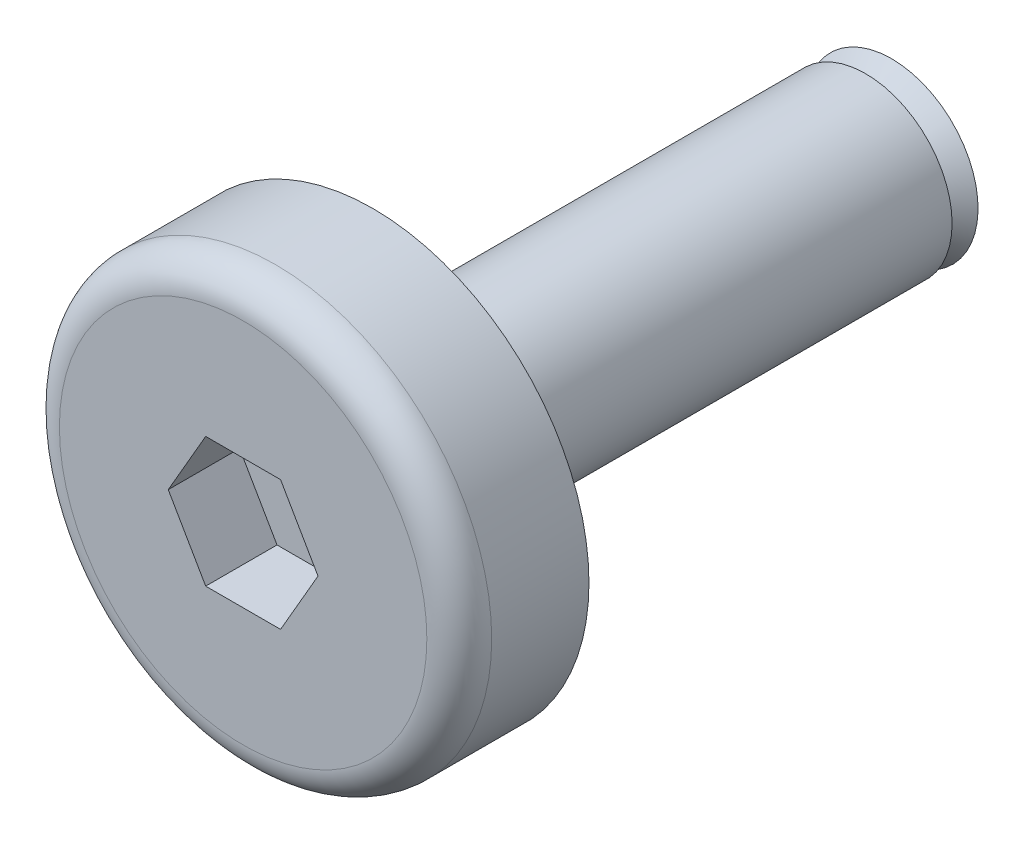
ISO-10303-21;
HEADER;
FILE_DESCRIPTION(('STEP AP214'),'2;1');
FILE_NAME('part.step','',(''),(''),'','','');
FILE_SCHEMA(('AUTOMOTIVE_DESIGN { 1 0 10303 214 1 1 1 1 }'));
ENDSEC;
DATA;
#1=APPLICATION_CONTEXT('core data for automotive mechanical design processes');
#2=APPLICATION_PROTOCOL_DEFINITION('international standard','automotive_design',2000,#1);
#3=PRODUCT_CONTEXT('',#1,'mechanical');
#4=PRODUCT('Part','Part','',(#3));
#5=PRODUCT_RELATED_PRODUCT_CATEGORY('part','',(#4));
#6=PRODUCT_DEFINITION_FORMATION('','',#4);
#7=PRODUCT_DEFINITION_CONTEXT('part definition',#1,'design');
#8=PRODUCT_DEFINITION('design','',#6,#7);
#9=PRODUCT_DEFINITION_SHAPE('','',#8);
#10=(LENGTH_UNIT() NAMED_UNIT(*) SI_UNIT(.MILLI.,.METRE.));
#11=(NAMED_UNIT(*) PLANE_ANGLE_UNIT() SI_UNIT($,.RADIAN.));
#12=(NAMED_UNIT(*) SI_UNIT($,.STERADIAN.) SOLID_ANGLE_UNIT());
#13=UNCERTAINTY_MEASURE_WITH_UNIT(LENGTH_MEASURE(1.E-05),#10,'distance_accuracy_value','');
#14=(GEOMETRIC_REPRESENTATION_CONTEXT(3) GLOBAL_UNCERTAINTY_ASSIGNED_CONTEXT((#13)) GLOBAL_UNIT_ASSIGNED_CONTEXT((#10,
#11,#12)) REPRESENTATION_CONTEXT('',''));
#15=CARTESIAN_POINT('',(0.,0.,0.));
#16=DIRECTION('',(0.,0.,1.));
#17=DIRECTION('',(1.,0.,0.));
#18=AXIS2_PLACEMENT_3D('',#15,#16,#17);
#19=CARTESIAN_POINT('',(0.,0.,1.5));
#20=DIRECTION('',(0.,0.,1.));
#21=DIRECTION('',(1.,0.,0.));
#22=AXIS2_PLACEMENT_3D('',#19,#20,#21);
#23=PLANE('',#22);
#24=CARTESIAN_POINT('',(0.,0.,1.5));
#25=DIRECTION('',(0.,0.,1.));
#26=DIRECTION('',(1.,0.,0.));
#27=AXIS2_PLACEMENT_3D('',#24,#25,#26);
#28=CIRCLE('',#27,2.125);
#29=CARTESIAN_POINT('',(2.125,0.,1.5));
#30=VERTEX_POINT('',#29);
#31=EDGE_CURVE('E142',#30,#30,#28,.T.);
#32=ORIENTED_EDGE('',*,*,#31,.T.);
#33=EDGE_LOOP('',(#32));
#34=FACE_BOUND('',#33,.T.);
#35=DIRECTION('',(0.5,-0.866025403784439,0.));
#36=VECTOR('',#35,1.);
#37=CARTESIAN_POINT('',(0.649519052838329,0.375,1.5));
#38=LINE('',#37,#36);
#39=CARTESIAN_POINT('',(0.433012701892219,0.75,1.5));
#40=VERTEX_POINT('',#39);
#41=CARTESIAN_POINT('',(0.866025403784439,0.,1.5));
#42=VERTEX_POINT('',#41);
#43=EDGE_CURVE('E51',#40,#42,#38,.T.);
#44=ORIENTED_EDGE('',*,*,#43,.T.);
#45=DIRECTION('',(-0.5,-0.866025403784439,0.));
#46=VECTOR('',#45,1.);
#47=CARTESIAN_POINT('',(0.649519052838329,-0.375,1.5));
#48=LINE('',#47,#46);
#49=CARTESIAN_POINT('',(0.433012701892219,-0.75,1.5));
#50=VERTEX_POINT('',#49);
#51=EDGE_CURVE('E11',#42,#50,#48,.T.);
#52=ORIENTED_EDGE('',*,*,#51,.T.);
#53=DIRECTION('',(-1.,0.,0.));
#54=VECTOR('',#53,1.);
#55=CARTESIAN_POINT('',(0.,-0.75,1.5));
#56=LINE('',#55,#54);
#57=CARTESIAN_POINT('',(-0.43301270189222,-0.75,1.5));
#58=VERTEX_POINT('',#57);
#59=EDGE_CURVE('E148',#50,#58,#56,.T.);
#60=ORIENTED_EDGE('',*,*,#59,.T.);
#61=DIRECTION('',(-0.5,0.866025403784439,0.));
#62=VECTOR('',#61,1.);
#63=CARTESIAN_POINT('',(-0.649519052838329,-0.375,1.5));
#64=LINE('',#63,#62);
#65=CARTESIAN_POINT('',(-0.866025403784439,0.,1.5));
#66=VERTEX_POINT('',#65);
#67=EDGE_CURVE('E151',#58,#66,#64,.T.);
#68=ORIENTED_EDGE('',*,*,#67,.T.);
#69=DIRECTION('',(0.5,0.866025403784438,0.));
#70=VECTOR('',#69,1.);
#71=CARTESIAN_POINT('',(-0.649519052838329,0.375,1.5));
#72=LINE('',#71,#70);
#73=CARTESIAN_POINT('',(-0.433012701892219,0.75,1.5));
#74=VERTEX_POINT('',#73);
#75=EDGE_CURVE('E154',#66,#74,#72,.T.);
#76=ORIENTED_EDGE('',*,*,#75,.T.);
#77=DIRECTION('',(1.,0.,0.));
#78=VECTOR('',#77,1.);
#79=CARTESIAN_POINT('',(0.,0.75,1.5));
#80=LINE('',#79,#78);
#81=EDGE_CURVE('E157',#74,#40,#80,.T.);
#82=ORIENTED_EDGE('',*,*,#81,.T.);
#83=EDGE_LOOP('',(#44,#52,#60,#68,#76,#82));
#84=FACE_BOUND('',#83,.T.);
#85=ADVANCED_FACE('F43',(#34,#84),#23,.T.);
#86=CARTESIAN_POINT('',(0.,0.,1.5));
#87=DIRECTION('',(0.,0.,-1.));
#88=DIRECTION('',(-1.,0.,0.));
#89=AXIS2_PLACEMENT_3D('',#86,#87,#88);
#90=CYLINDRICAL_SURFACE('',#89,2.5);
#91=CARTESIAN_POINT('',(0.,0.,1.125));
#92=DIRECTION('',(0.,0.,1.));
#93=DIRECTION('',(1.,0.,0.));
#94=AXIS2_PLACEMENT_3D('',#91,#92,#93);
#95=CIRCLE('',#94,2.5);
#96=CARTESIAN_POINT('',(2.5,0.,1.125));
#97=VERTEX_POINT('',#96);
#98=EDGE_CURVE('E145',#97,#97,#95,.F.);
#99=ORIENTED_EDGE('',*,*,#98,.T.);
#100=EDGE_LOOP('',(#99));
#101=FACE_BOUND('',#100,.T.);
#102=CARTESIAN_POINT('',(0.,0.,0.));
#103=DIRECTION('',(0.,0.,1.));
#104=DIRECTION('',(1.,0.,0.));
#105=AXIS2_PLACEMENT_3D('',#102,#103,#104);
#106=CIRCLE('',#105,2.5);
#107=CARTESIAN_POINT('',(2.5,0.,0.));
#108=VERTEX_POINT('',#107);
#109=EDGE_CURVE('E100',#108,#108,#106,.T.);
#110=ORIENTED_EDGE('',*,*,#109,.T.);
#111=EDGE_LOOP('',(#110));
#112=FACE_BOUND('',#111,.T.);
#113=ADVANCED_FACE('F181',(#101,#112),#90,.T.);
#114=CARTESIAN_POINT('',(0.,0.,0.));
#115=DIRECTION('',(0.,0.,1.));
#116=DIRECTION('',(1.,0.,0.));
#117=AXIS2_PLACEMENT_3D('',#114,#115,#116);
#118=PLANE('',#117);
#119=CARTESIAN_POINT('',(0.,0.,0.));
#120=DIRECTION('',(0.,0.,1.));
#121=DIRECTION('',(1.,0.,0.));
#122=AXIS2_PLACEMENT_3D('',#119,#120,#121);
#123=CIRCLE('',#122,1.);
#124=CARTESIAN_POINT('',(1.,0.,0.));
#125=VERTEX_POINT('',#124);
#126=EDGE_CURVE('E119',#125,#125,#123,.T.);
#127=ORIENTED_EDGE('',*,*,#126,.T.);
#128=EDGE_LOOP('',(#127));
#129=FACE_BOUND('',#128,.T.);
#130=ORIENTED_EDGE('',*,*,#109,.F.);
#131=EDGE_LOOP('',(#130));
#132=FACE_BOUND('',#131,.T.);
#133=ADVANCED_FACE('F187',(#129,#132),#118,.F.);
#134=CARTESIAN_POINT('',(0.,0.,1.125));
#135=DIRECTION('',(0.,0.,1.));
#136=DIRECTION('',(1.,0.,0.));
#137=AXIS2_PLACEMENT_3D('',#134,#135,#136);
#138=TOROIDAL_SURFACE('',#137,2.125,0.375);
#139=ORIENTED_EDGE('',*,*,#98,.F.);
#140=EDGE_LOOP('',(#139));
#141=FACE_BOUND('',#140,.T.);
#142=ORIENTED_EDGE('',*,*,#31,.F.);
#143=EDGE_LOOP('',(#142));
#144=FACE_BOUND('',#143,.T.);
#145=ADVANCED_FACE('F45',(#141,#144),#138,.T.);
#146=CARTESIAN_POINT('',(0.433012701892219,-0.75,1.51));
#147=DIRECTION('',(-0.866025403784439,0.5,0.));
#148=DIRECTION('',(-0.5,-0.866025403784439,0.));
#149=AXIS2_PLACEMENT_3D('',#146,#147,#148);
#150=PLANE('',#149);
#151=DIRECTION('',(0.,0.,-1.));
#152=VECTOR('',#151,1.);
#153=CARTESIAN_POINT('',(0.866025403784439,0.,1.51));
#154=LINE('',#153,#152);
#155=CARTESIAN_POINT('',(0.866025403784439,0.,0.675));
#156=VERTEX_POINT('',#155);
#157=EDGE_CURVE('E93',#42,#156,#154,.T.);
#158=ORIENTED_EDGE('',*,*,#157,.T.);
#159=DIRECTION('',(0.5,0.866025403784439,0.));
#160=VECTOR('',#159,1.);
#161=CARTESIAN_POINT('',(0.433012701892219,-0.75,0.675));
#162=LINE('',#161,#160);
#163=CARTESIAN_POINT('',(0.433012701892219,-0.75,0.675));
#164=VERTEX_POINT('',#163);
#165=EDGE_CURVE('E97',#164,#156,#162,.T.);
#166=ORIENTED_EDGE('',*,*,#165,.F.);
#167=DIRECTION('',(0.,0.,-1.));
#168=VECTOR('',#167,1.);
#169=CARTESIAN_POINT('',(0.433012701892219,-0.75,1.51));
#170=LINE('',#169,#168);
#171=EDGE_CURVE('E132',#50,#164,#170,.T.);
#172=ORIENTED_EDGE('',*,*,#171,.F.);
#173=ORIENTED_EDGE('',*,*,#51,.F.);
#174=EDGE_LOOP('',(#158,#166,#172,#173));
#175=FACE_BOUND('',#174,.T.);
#176=ADVANCED_FACE('F95',(#175),#150,.T.);
#177=CARTESIAN_POINT('',(0.866025403784439,0.,1.51));
#178=DIRECTION('',(-0.866025403784439,-0.5,0.));
#179=DIRECTION('',(0.,0.,1.));
#180=AXIS2_PLACEMENT_3D('',#177,#178,#179);
#181=PLANE('',#180);
#182=DIRECTION('',(0.,0.,-1.));
#183=VECTOR('',#182,1.);
#184=CARTESIAN_POINT('',(0.433012701892219,0.75,1.51));
#185=LINE('',#184,#183);
#186=CARTESIAN_POINT('',(0.433012701892219,0.75,0.675));
#187=VERTEX_POINT('',#186);
#188=EDGE_CURVE('E101',#40,#187,#185,.T.);
#189=ORIENTED_EDGE('',*,*,#188,.T.);
#190=DIRECTION('',(-0.5,0.866025403784439,0.));
#191=VECTOR('',#190,1.);
#192=CARTESIAN_POINT('',(0.866025403784439,0.,0.675));
#193=LINE('',#192,#191);
#194=EDGE_CURVE('E104',#156,#187,#193,.T.);
#195=ORIENTED_EDGE('',*,*,#194,.F.);
#196=ORIENTED_EDGE('',*,*,#157,.F.);
#197=ORIENTED_EDGE('',*,*,#43,.F.);
#198=EDGE_LOOP('',(#189,#195,#196,#197));
#199=FACE_BOUND('',#198,.T.);
#200=ADVANCED_FACE('F105',(#199),#181,.T.);
#201=CARTESIAN_POINT('',(0.433012701892219,0.75,1.51));
#202=DIRECTION('',(0.,-1.,0.));
#203=DIRECTION('',(1.,0.,0.));
#204=AXIS2_PLACEMENT_3D('',#201,#202,#203);
#205=PLANE('',#204);
#206=DIRECTION('',(0.,0.,-1.));
#207=VECTOR('',#206,1.);
#208=CARTESIAN_POINT('',(-0.433012701892219,0.75,1.51));
#209=LINE('',#208,#207);
#210=CARTESIAN_POINT('',(-0.433012701892219,0.75,0.675));
#211=VERTEX_POINT('',#210);
#212=EDGE_CURVE('E137',#74,#211,#209,.T.);
#213=ORIENTED_EDGE('',*,*,#212,.T.);
#214=DIRECTION('',(-1.,0.,0.));
#215=VECTOR('',#214,1.);
#216=CARTESIAN_POINT('',(0.433012701892219,0.75,0.675));
#217=LINE('',#216,#215);
#218=EDGE_CURVE('E110',#187,#211,#217,.T.);
#219=ORIENTED_EDGE('',*,*,#218,.F.);
#220=ORIENTED_EDGE('',*,*,#188,.F.);
#221=ORIENTED_EDGE('',*,*,#81,.F.);
#222=EDGE_LOOP('',(#213,#219,#220,#221));
#223=FACE_BOUND('',#222,.T.);
#224=ADVANCED_FACE('F161',(#223),#205,.T.);
#225=CARTESIAN_POINT('',(-0.433012701892219,0.75,1.51));
#226=DIRECTION('',(0.866025403784439,-0.5,0.));
#227=DIRECTION('',(0.500000000000001,0.866025403784439,0.));
#228=AXIS2_PLACEMENT_3D('',#225,#226,#227);
#229=PLANE('',#228);
#230=DIRECTION('',(0.,0.,-1.));
#231=VECTOR('',#230,1.);
#232=CARTESIAN_POINT('',(-0.866025403784439,0.,1.51));
#233=LINE('',#232,#231);
#234=CARTESIAN_POINT('',(-0.866025403784439,0.,0.675));
#235=VERTEX_POINT('',#234);
#236=EDGE_CURVE('E135',#66,#235,#233,.T.);
#237=ORIENTED_EDGE('',*,*,#236,.T.);
#238=DIRECTION('',(-0.5,-0.866025403784439,0.));
#239=VECTOR('',#238,1.);
#240=CARTESIAN_POINT('',(-0.433012701892219,0.75,0.675));
#241=LINE('',#240,#239);
#242=EDGE_CURVE('E126',#211,#235,#241,.T.);
#243=ORIENTED_EDGE('',*,*,#242,.F.);
#244=ORIENTED_EDGE('',*,*,#212,.F.);
#245=ORIENTED_EDGE('',*,*,#75,.F.);
#246=EDGE_LOOP('',(#237,#243,#244,#245));
#247=FACE_BOUND('',#246,.T.);
#248=ADVANCED_FACE('F166',(#247),#229,.T.);
#249=CARTESIAN_POINT('',(-0.866025403784439,0.,1.51));
#250=DIRECTION('',(0.866025403784439,0.5,0.));
#251=DIRECTION('',(0.,0.,-1.));
#252=AXIS2_PLACEMENT_3D('',#249,#250,#251);
#253=PLANE('',#252);
#254=DIRECTION('',(0.,0.,-1.));
#255=VECTOR('',#254,1.);
#256=CARTESIAN_POINT('',(-0.43301270189222,-0.75,1.51));
#257=LINE('',#256,#255);
#258=CARTESIAN_POINT('',(-0.43301270189222,-0.75,0.675));
#259=VERTEX_POINT('',#258);
#260=EDGE_CURVE('E58',#58,#259,#257,.T.);
#261=ORIENTED_EDGE('',*,*,#260,.T.);
#262=DIRECTION('',(0.5,-0.866025403784439,0.));
#263=VECTOR('',#262,1.);
#264=CARTESIAN_POINT('',(-0.866025403784439,0.,0.675));
#265=LINE('',#264,#263);
#266=EDGE_CURVE('E129',#235,#259,#265,.T.);
#267=ORIENTED_EDGE('',*,*,#266,.F.);
#268=ORIENTED_EDGE('',*,*,#236,.F.);
#269=ORIENTED_EDGE('',*,*,#67,.F.);
#270=EDGE_LOOP('',(#261,#267,#268,#269));
#271=FACE_BOUND('',#270,.T.);
#272=ADVANCED_FACE('F169',(#271),#253,.T.);
#273=CARTESIAN_POINT('',(-0.43301270189222,-0.75,1.51));
#274=DIRECTION('',(0.,1.,0.));
#275=DIRECTION('',(-1.,0.,0.));
#276=AXIS2_PLACEMENT_3D('',#273,#274,#275);
#277=PLANE('',#276);
#278=ORIENTED_EDGE('',*,*,#171,.T.);
#279=DIRECTION('',(1.,0.,0.));
#280=VECTOR('',#279,1.);
#281=CARTESIAN_POINT('',(-0.43301270189222,-0.75,0.675));
#282=LINE('',#281,#280);
#283=EDGE_CURVE('E115',#259,#164,#282,.T.);
#284=ORIENTED_EDGE('',*,*,#283,.F.);
#285=ORIENTED_EDGE('',*,*,#260,.F.);
#286=ORIENTED_EDGE('',*,*,#59,.F.);
#287=EDGE_LOOP('',(#278,#284,#285,#286));
#288=FACE_BOUND('',#287,.T.);
#289=ADVANCED_FACE('F170',(#288),#277,.T.);
#290=CARTESIAN_POINT('',(0.866025403784439,0.,0.675));
#291=DIRECTION('',(0.,0.,1.));
#292=DIRECTION('',(-0.5,0.866025403784439,0.));
#293=AXIS2_PLACEMENT_3D('',#290,#291,#292);
#294=PLANE('',#293);
#295=ORIENTED_EDGE('',*,*,#165,.T.);
#296=ORIENTED_EDGE('',*,*,#194,.T.);
#297=ORIENTED_EDGE('',*,*,#218,.T.);
#298=ORIENTED_EDGE('',*,*,#242,.T.);
#299=ORIENTED_EDGE('',*,*,#266,.T.);
#300=ORIENTED_EDGE('',*,*,#283,.T.);
#301=EDGE_LOOP('',(#295,#296,#297,#298,#299,#300));
#302=FACE_BOUND('',#301,.T.);
#303=ADVANCED_FACE('F113',(#302),#294,.T.);
#304=CARTESIAN_POINT('',(0.,0.,0.));
#305=DIRECTION('',(0.,0.,-1.));
#306=DIRECTION('',(-1.,0.,0.));
#307=AXIS2_PLACEMENT_3D('',#304,#305,#306);
#308=CYLINDRICAL_SURFACE('',#307,1.);
#309=ORIENTED_EDGE('',*,*,#126,.F.);
#310=EDGE_LOOP('',(#309));
#311=FACE_BOUND('',#310,.T.);
#312=CARTESIAN_POINT('',(0.,0.,-5.7));
#313=DIRECTION('',(0.,0.,1.));
#314=DIRECTION('',(1.,0.,0.));
#315=AXIS2_PLACEMENT_3D('',#312,#313,#314);
#316=CIRCLE('',#315,1.);
#317=CARTESIAN_POINT('',(1.,0.,-5.7));
#318=VERTEX_POINT('',#317);
#319=EDGE_CURVE('E122',#318,#318,#316,.T.);
#320=ORIENTED_EDGE('',*,*,#319,.T.);
#321=EDGE_LOOP('',(#320));
#322=FACE_BOUND('',#321,.T.);
#323=ADVANCED_FACE('F177',(#311,#322),#308,.T.);
#324=CARTESIAN_POINT('',(0.,0.,-5.7));
#325=DIRECTION('',(0.,0.,1.));
#326=DIRECTION('',(1.,0.,0.));
#327=AXIS2_PLACEMENT_3D('',#324,#325,#326);
#328=PLANE('',#327);
#329=CARTESIAN_POINT('',(0.,0.,-5.70000000000001));
#330=DIRECTION('',(0.,0.,-1.));
#331=DIRECTION('',(0.,1.,0.));
#332=AXIS2_PLACEMENT_3D('',#329,#330,#331);
#333=CIRCLE('',#332,0.7);
#334=CARTESIAN_POINT('',(0.,0.7,-5.70000000000001));
#335=VERTEX_POINT('',#334);
#336=EDGE_CURVE('E116',#335,#335,#333,.T.);
#337=ORIENTED_EDGE('',*,*,#336,.F.);
#338=EDGE_LOOP('',(#337));
#339=FACE_BOUND('',#338,.T.);
#340=ORIENTED_EDGE('',*,*,#319,.F.);
#341=EDGE_LOOP('',(#340));
#342=FACE_BOUND('',#341,.T.);
#343=ADVANCED_FACE('F219',(#339,#342),#328,.F.);
#344=CARTESIAN_POINT('',(0.,0.,-6.));
#345=DIRECTION('',(0.,0.,-1.));
#346=DIRECTION('',(0.,1.,0.));
#347=AXIS2_PLACEMENT_3D('',#344,#345,#346);
#348=PLANE('',#347);
#349=CARTESIAN_POINT('',(0.,0.,-6.));
#350=DIRECTION('',(0.,0.,-1.));
#351=DIRECTION('',(0.,1.,0.));
#352=AXIS2_PLACEMENT_3D('',#349,#350,#351);
#353=CIRCLE('',#352,1.);
#354=CARTESIAN_POINT('',(0.,1.,-6.));
#355=VERTEX_POINT('',#354);
#356=EDGE_CURVE('E205',#355,#355,#353,.T.);
#357=ORIENTED_EDGE('',*,*,#356,.T.);
#358=EDGE_LOOP('',(#357));
#359=FACE_BOUND('',#358,.T.);
#360=ADVANCED_FACE('F210',(#359),#348,.T.);
#361=CARTESIAN_POINT('',(0.,0.,-6.));
#362=DIRECTION('',(0.,0.,-1.));
#363=DIRECTION('',(0.,1.,0.));
#364=AXIS2_PLACEMENT_3D('',#361,#362,#363);
#365=CONICAL_SURFACE('',#364,1.,0.785398163397457);
#366=ORIENTED_EDGE('',*,*,#336,.T.);
#367=EDGE_LOOP('',(#366));
#368=FACE_BOUND('',#367,.T.);
#369=ORIENTED_EDGE('',*,*,#356,.F.);
#370=EDGE_LOOP('',(#369));
#371=FACE_BOUND('',#370,.T.);
#372=ADVANCED_FACE('F212',(#368,#371),#365,.T.);
#373=CLOSED_SHELL('',(#85,#113,#133,#145,#176,#200,#224,#248,#272,#289,#303,#323,#343,#360,#372));
#374=MANIFOLD_SOLID_BREP('B2',#373);
#375=ADVANCED_BREP_SHAPE_REPRESENTATION('',(#18,#374),#14);
#376=SHAPE_DEFINITION_REPRESENTATION(#9,#375);
ENDSEC;
END-ISO-10303-21;
